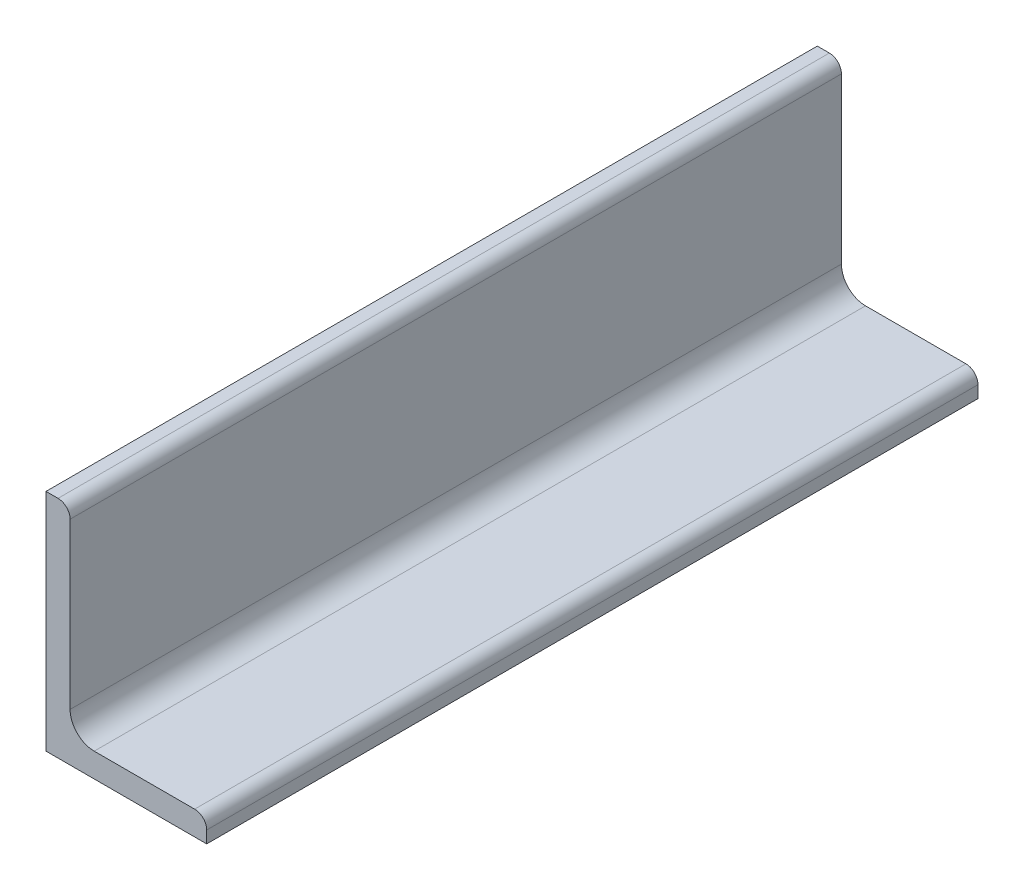
ISO-10303-21;
HEADER;
FILE_DESCRIPTION(('STEP AP214'),'2;1');
FILE_NAME('part.step','',(''),(''),'','','');
FILE_SCHEMA(('AUTOMOTIVE_DESIGN { 1 0 10303 214 1 1 1 1 }'));
ENDSEC;
DATA;
#1=APPLICATION_CONTEXT('core data for automotive mechanical design processes');
#2=APPLICATION_PROTOCOL_DEFINITION('international standard','automotive_design',2000,#1);
#3=PRODUCT_CONTEXT('',#1,'mechanical');
#4=PRODUCT('Part','Part','',(#3));
#5=PRODUCT_RELATED_PRODUCT_CATEGORY('part','',(#4));
#6=PRODUCT_DEFINITION_FORMATION('','',#4);
#7=PRODUCT_DEFINITION_CONTEXT('part definition',#1,'design');
#8=PRODUCT_DEFINITION('design','',#6,#7);
#9=PRODUCT_DEFINITION_SHAPE('','',#8);
#10=(LENGTH_UNIT() NAMED_UNIT(*) SI_UNIT(.MILLI.,.METRE.));
#11=(NAMED_UNIT(*) PLANE_ANGLE_UNIT() SI_UNIT($,.RADIAN.));
#12=(NAMED_UNIT(*) SI_UNIT($,.STERADIAN.) SOLID_ANGLE_UNIT());
#13=UNCERTAINTY_MEASURE_WITH_UNIT(LENGTH_MEASURE(1.E-05),#10,'distance_accuracy_value','');
#14=(GEOMETRIC_REPRESENTATION_CONTEXT(3) GLOBAL_UNCERTAINTY_ASSIGNED_CONTEXT((#13)) GLOBAL_UNIT_ASSIGNED_CONTEXT((#10,
#11,#12)) REPRESENTATION_CONTEXT('',''));
#15=CARTESIAN_POINT('',(0.,0.,0.));
#16=DIRECTION('',(0.,0.,1.));
#17=DIRECTION('',(1.,0.,0.));
#18=AXIS2_PLACEMENT_3D('',#15,#16,#17);
#19=CARTESIAN_POINT('',(0.897927251325018,89.7372005393545,304.8));
#20=DIRECTION('',(1.,0.,0.));
#21=DIRECTION('',(0.,0.,-1.));
#22=AXIS2_PLACEMENT_3D('',#19,#20,#21);
#23=PLANE('',#22);
#24=DIRECTION('',(0.,-1.,0.));
#25=VECTOR('',#24,1.);
#26=CARTESIAN_POINT('',(0.897927251325018,89.7372005393545,0.));
#27=LINE('',#26,#25);
#28=CARTESIAN_POINT('',(0.897927251325018,89.7372005393545,0.));
#29=VERTEX_POINT('',#28);
#30=CARTESIAN_POINT('',(0.897927251325018,0.837200539354535,0.));
#31=VERTEX_POINT('',#30);
#32=EDGE_CURVE('E135',#29,#31,#27,.T.);
#33=ORIENTED_EDGE('',*,*,#32,.T.);
#34=DIRECTION('',(0.,0.,-1.));
#35=VECTOR('',#34,1.);
#36=CARTESIAN_POINT('',(0.897927251325018,0.837200539354535,304.8));
#37=LINE('',#36,#35);
#38=CARTESIAN_POINT('',(0.897927251325018,0.837200539354535,304.8));
#39=VERTEX_POINT('',#38);
#40=EDGE_CURVE('E11',#39,#31,#37,.T.);
#41=ORIENTED_EDGE('',*,*,#40,.F.);
#42=DIRECTION('',(0.,-1.,0.));
#43=VECTOR('',#42,1.);
#44=CARTESIAN_POINT('',(0.897927251325018,89.7372005393545,304.8));
#45=LINE('',#44,#43);
#46=CARTESIAN_POINT('',(0.897927251325018,89.7372005393545,304.8));
#47=VERTEX_POINT('',#46);
#48=EDGE_CURVE('E151',#47,#39,#45,.T.);
#49=ORIENTED_EDGE('',*,*,#48,.F.);
#50=DIRECTION('',(0.,0.,-1.));
#51=VECTOR('',#50,1.);
#52=CARTESIAN_POINT('',(0.897927251325018,89.7372005393545,304.8));
#53=LINE('',#52,#51);
#54=EDGE_CURVE('E131',#47,#29,#53,.T.);
#55=ORIENTED_EDGE('',*,*,#54,.T.);
#56=EDGE_LOOP('',(#33,#41,#49,#55));
#57=FACE_BOUND('',#56,.T.);
#58=ADVANCED_FACE('F33',(#57),#23,.F.);
#59=CARTESIAN_POINT('',(0.897927251325018,0.837200539354535,304.8));
#60=DIRECTION('',(0.,1.,0.));
#61=DIRECTION('',(0.,0.,1.));
#62=AXIS2_PLACEMENT_3D('',#59,#60,#61);
#63=PLANE('',#62);
#64=DIRECTION('',(1.,0.,0.));
#65=VECTOR('',#64,1.);
#66=CARTESIAN_POINT('',(0.897927251325018,0.837200539354535,0.));
#67=LINE('',#66,#65);
#68=CARTESIAN_POINT('',(64.397927251325,0.837200539354535,0.));
#69=VERTEX_POINT('',#68);
#70=EDGE_CURVE('E138',#31,#69,#67,.T.);
#71=ORIENTED_EDGE('',*,*,#70,.T.);
#72=DIRECTION('',(0.,0.,-1.));
#73=VECTOR('',#72,1.);
#74=CARTESIAN_POINT('',(64.397927251325,0.837200539354535,304.8));
#75=LINE('',#74,#73);
#76=CARTESIAN_POINT('',(64.397927251325,0.837200539354535,304.8));
#77=VERTEX_POINT('',#76);
#78=EDGE_CURVE('E41',#77,#69,#75,.T.);
#79=ORIENTED_EDGE('',*,*,#78,.F.);
#80=DIRECTION('',(1.,0.,0.));
#81=VECTOR('',#80,1.);
#82=CARTESIAN_POINT('',(0.897927251325018,0.837200539354535,304.8));
#83=LINE('',#82,#81);
#84=EDGE_CURVE('E95',#39,#77,#83,.T.);
#85=ORIENTED_EDGE('',*,*,#84,.F.);
#86=ORIENTED_EDGE('',*,*,#40,.T.);
#87=EDGE_LOOP('',(#71,#79,#85,#86));
#88=FACE_BOUND('',#87,.T.);
#89=ADVANCED_FACE('F194',(#88),#63,.F.);
#90=CARTESIAN_POINT('',(64.397927251325,0.837200539354535,304.8));
#91=DIRECTION('',(-1.,0.,0.));
#92=DIRECTION('',(0.,0.,1.));
#93=AXIS2_PLACEMENT_3D('',#90,#91,#92);
#94=PLANE('',#93);
#95=DIRECTION('',(0.,1.,0.));
#96=VECTOR('',#95,1.);
#97=CARTESIAN_POINT('',(64.397927251325,0.837200539354535,0.));
#98=LINE('',#97,#96);
#99=CARTESIAN_POINT('',(64.397927251325,5.59970053935453,0.));
#100=VERTEX_POINT('',#99);
#101=EDGE_CURVE('E140',#69,#100,#98,.T.);
#102=ORIENTED_EDGE('',*,*,#101,.T.);
#103=DIRECTION('',(0.,0.,-1.));
#104=VECTOR('',#103,1.);
#105=CARTESIAN_POINT('',(64.397927251325,5.59970053935453,304.8));
#106=LINE('',#105,#104);
#107=CARTESIAN_POINT('',(64.397927251325,5.59970053935453,304.8));
#108=VERTEX_POINT('',#107);
#109=EDGE_CURVE('E161',#108,#100,#106,.T.);
#110=ORIENTED_EDGE('',*,*,#109,.F.);
#111=DIRECTION('',(0.,1.,0.));
#112=VECTOR('',#111,1.);
#113=CARTESIAN_POINT('',(64.397927251325,0.837200539354535,304.8));
#114=LINE('',#113,#112);
#115=EDGE_CURVE('E169',#77,#108,#114,.T.);
#116=ORIENTED_EDGE('',*,*,#115,.F.);
#117=ORIENTED_EDGE('',*,*,#78,.T.);
#118=EDGE_LOOP('',(#102,#110,#116,#117));
#119=FACE_BOUND('',#118,.T.);
#120=ADVANCED_FACE('F167',(#119),#94,.F.);
#121=CARTESIAN_POINT('',(59.635427251325,5.59970053935453,304.8));
#122=DIRECTION('',(0.,0.,-1.));
#123=DIRECTION('',(-1.,0.,0.));
#124=AXIS2_PLACEMENT_3D('',#121,#122,#123);
#125=CYLINDRICAL_SURFACE('',#124,4.7625);
#126=CARTESIAN_POINT('',(59.635427251325,5.59970053935453,0.));
#127=DIRECTION('',(0.,0.,1.));
#128=DIRECTION('',(1.,0.,0.));
#129=AXIS2_PLACEMENT_3D('',#126,#127,#128);
#130=CIRCLE('',#129,4.7625);
#131=CARTESIAN_POINT('',(59.635427251325,10.3622005393545,0.));
#132=VERTEX_POINT('',#131);
#133=EDGE_CURVE('E142',#100,#132,#130,.T.);
#134=ORIENTED_EDGE('',*,*,#133,.T.);
#135=DIRECTION('',(0.,0.,-1.));
#136=VECTOR('',#135,1.);
#137=CARTESIAN_POINT('',(59.635427251325,10.3622005393545,304.8));
#138=LINE('',#137,#136);
#139=CARTESIAN_POINT('',(59.635427251325,10.3622005393545,304.8));
#140=VERTEX_POINT('',#139);
#141=EDGE_CURVE('E158',#140,#132,#138,.T.);
#142=ORIENTED_EDGE('',*,*,#141,.F.);
#143=CARTESIAN_POINT('',(59.635427251325,5.59970053935453,304.8));
#144=DIRECTION('',(0.,0.,1.));
#145=DIRECTION('',(1.,0.,0.));
#146=AXIS2_PLACEMENT_3D('',#143,#144,#145);
#147=CIRCLE('',#146,4.7625);
#148=EDGE_CURVE('E185',#108,#140,#147,.T.);
#149=ORIENTED_EDGE('',*,*,#148,.F.);
#150=ORIENTED_EDGE('',*,*,#109,.T.);
#151=EDGE_LOOP('',(#134,#142,#149,#150));
#152=FACE_BOUND('',#151,.T.);
#153=ADVANCED_FACE('F178',(#152),#125,.T.);
#154=CARTESIAN_POINT('',(59.635427251325,10.3622005393545,304.8));
#155=DIRECTION('',(0.,-1.,0.));
#156=DIRECTION('',(0.,0.,-1.));
#157=AXIS2_PLACEMENT_3D('',#154,#155,#156);
#158=PLANE('',#157);
#159=DIRECTION('',(-1.,0.,0.));
#160=VECTOR('',#159,1.);
#161=CARTESIAN_POINT('',(59.635427251325,10.3622005393545,0.));
#162=LINE('',#161,#160);
#163=CARTESIAN_POINT('',(19.947927251325,10.3622005393545,0.));
#164=VERTEX_POINT('',#163);
#165=EDGE_CURVE('E144',#132,#164,#162,.T.);
#166=ORIENTED_EDGE('',*,*,#165,.T.);
#167=DIRECTION('',(0.,0.,-1.));
#168=VECTOR('',#167,1.);
#169=CARTESIAN_POINT('',(19.947927251325,10.3622005393545,304.8));
#170=LINE('',#169,#168);
#171=CARTESIAN_POINT('',(19.947927251325,10.3622005393545,304.8));
#172=VERTEX_POINT('',#171);
#173=EDGE_CURVE('E155',#172,#164,#170,.T.);
#174=ORIENTED_EDGE('',*,*,#173,.F.);
#175=DIRECTION('',(-1.,0.,0.));
#176=VECTOR('',#175,1.);
#177=CARTESIAN_POINT('',(59.635427251325,10.3622005393545,304.8));
#178=LINE('',#177,#176);
#179=EDGE_CURVE('E184',#140,#172,#178,.T.);
#180=ORIENTED_EDGE('',*,*,#179,.F.);
#181=ORIENTED_EDGE('',*,*,#141,.T.);
#182=EDGE_LOOP('',(#166,#174,#180,#181));
#183=FACE_BOUND('',#182,.T.);
#184=ADVANCED_FACE('F182',(#183),#158,.F.);
#185=CARTESIAN_POINT('',(19.947927251325,19.8872005393545,304.8));
#186=DIRECTION('',(0.,0.,-1.));
#187=DIRECTION('',(-1.,0.,0.));
#188=AXIS2_PLACEMENT_3D('',#185,#186,#187);
#189=CYLINDRICAL_SURFACE('',#188,9.52499999999999);
#190=CARTESIAN_POINT('',(19.947927251325,19.8872005393545,0.));
#191=DIRECTION('',(0.,0.,-1.));
#192=DIRECTION('',(1.,0.,0.));
#193=AXIS2_PLACEMENT_3D('',#190,#191,#192);
#194=CIRCLE('',#193,9.52499999999999);
#195=CARTESIAN_POINT('',(10.422927251325,19.8872005393545,0.));
#196=VERTEX_POINT('',#195);
#197=EDGE_CURVE('E146',#164,#196,#194,.T.);
#198=ORIENTED_EDGE('',*,*,#197,.T.);
#199=DIRECTION('',(0.,0.,-1.));
#200=VECTOR('',#199,1.);
#201=CARTESIAN_POINT('',(10.422927251325,19.8872005393545,304.8));
#202=LINE('',#201,#200);
#203=CARTESIAN_POINT('',(10.422927251325,19.8872005393545,304.8));
#204=VERTEX_POINT('',#203);
#205=EDGE_CURVE('E126',#204,#196,#202,.T.);
#206=ORIENTED_EDGE('',*,*,#205,.F.);
#207=CARTESIAN_POINT('',(19.947927251325,19.8872005393545,304.8));
#208=DIRECTION('',(0.,0.,-1.));
#209=DIRECTION('',(1.,0.,0.));
#210=AXIS2_PLACEMENT_3D('',#207,#208,#209);
#211=CIRCLE('',#210,9.52499999999999);
#212=EDGE_CURVE('E117',#172,#204,#211,.T.);
#213=ORIENTED_EDGE('',*,*,#212,.F.);
#214=ORIENTED_EDGE('',*,*,#173,.T.);
#215=EDGE_LOOP('',(#198,#206,#213,#214));
#216=FACE_BOUND('',#215,.T.);
#217=ADVANCED_FACE('F206',(#216),#189,.F.);
#218=CARTESIAN_POINT('',(10.422927251325,19.8872005393545,304.8));
#219=DIRECTION('',(-1.,0.,0.));
#220=DIRECTION('',(0.,0.,1.));
#221=AXIS2_PLACEMENT_3D('',#218,#219,#220);
#222=PLANE('',#221);
#223=DIRECTION('',(0.,1.,0.));
#224=VECTOR('',#223,1.);
#225=CARTESIAN_POINT('',(10.422927251325,19.8872005393545,0.));
#226=LINE('',#225,#224);
#227=CARTESIAN_POINT('',(10.422927251325,84.9747005393545,0.));
#228=VERTEX_POINT('',#227);
#229=EDGE_CURVE('E125',#196,#228,#226,.T.);
#230=ORIENTED_EDGE('',*,*,#229,.T.);
#231=DIRECTION('',(0.,0.,-1.));
#232=VECTOR('',#231,1.);
#233=CARTESIAN_POINT('',(10.422927251325,84.9747005393545,304.8));
#234=LINE('',#233,#232);
#235=CARTESIAN_POINT('',(10.422927251325,84.9747005393545,304.8));
#236=VERTEX_POINT('',#235);
#237=EDGE_CURVE('E122',#236,#228,#234,.T.);
#238=ORIENTED_EDGE('',*,*,#237,.F.);
#239=DIRECTION('',(0.,1.,0.));
#240=VECTOR('',#239,1.);
#241=CARTESIAN_POINT('',(10.422927251325,19.8872005393545,304.8));
#242=LINE('',#241,#240);
#243=EDGE_CURVE('E111',#204,#236,#242,.T.);
#244=ORIENTED_EDGE('',*,*,#243,.F.);
#245=ORIENTED_EDGE('',*,*,#205,.T.);
#246=EDGE_LOOP('',(#230,#238,#244,#245));
#247=FACE_BOUND('',#246,.T.);
#248=ADVANCED_FACE('F123',(#247),#222,.F.);
#249=CARTESIAN_POINT('',(5.66042725132501,84.9747005393545,304.8));
#250=DIRECTION('',(0.,0.,-1.));
#251=DIRECTION('',(-1.,0.,0.));
#252=AXIS2_PLACEMENT_3D('',#249,#250,#251);
#253=CYLINDRICAL_SURFACE('',#252,4.7625);
#254=CARTESIAN_POINT('',(5.66042725132501,84.9747005393545,0.));
#255=DIRECTION('',(0.,0.,1.));
#256=DIRECTION('',(1.,0.,0.));
#257=AXIS2_PLACEMENT_3D('',#254,#255,#256);
#258=CIRCLE('',#257,4.7625);
#259=CARTESIAN_POINT('',(5.66042725132502,89.7372005393545,0.));
#260=VERTEX_POINT('',#259);
#261=EDGE_CURVE('E81',#228,#260,#258,.T.);
#262=ORIENTED_EDGE('',*,*,#261,.T.);
#263=DIRECTION('',(0.,0.,-1.));
#264=VECTOR('',#263,1.);
#265=CARTESIAN_POINT('',(5.66042725132502,89.7372005393545,304.8));
#266=LINE('',#265,#264);
#267=CARTESIAN_POINT('',(5.66042725132502,89.7372005393545,304.8));
#268=VERTEX_POINT('',#267);
#269=EDGE_CURVE('E127',#268,#260,#266,.T.);
#270=ORIENTED_EDGE('',*,*,#269,.F.);
#271=CARTESIAN_POINT('',(5.66042725132501,84.9747005393545,304.8));
#272=DIRECTION('',(0.,0.,1.));
#273=DIRECTION('',(1.,0.,0.));
#274=AXIS2_PLACEMENT_3D('',#271,#272,#273);
#275=CIRCLE('',#274,4.7625);
#276=EDGE_CURVE('E115',#236,#268,#275,.T.);
#277=ORIENTED_EDGE('',*,*,#276,.F.);
#278=ORIENTED_EDGE('',*,*,#237,.T.);
#279=EDGE_LOOP('',(#262,#270,#277,#278));
#280=FACE_BOUND('',#279,.T.);
#281=ADVANCED_FACE('F129',(#280),#253,.T.);
#282=CARTESIAN_POINT('',(5.66042725132502,89.7372005393545,304.8));
#283=DIRECTION('',(0.,-1.,0.));
#284=DIRECTION('',(0.,0.,-1.));
#285=AXIS2_PLACEMENT_3D('',#282,#283,#284);
#286=PLANE('',#285);
#287=DIRECTION('',(-1.,0.,0.));
#288=VECTOR('',#287,1.);
#289=CARTESIAN_POINT('',(5.66042725132502,89.7372005393545,0.));
#290=LINE('',#289,#288);
#291=EDGE_CURVE('E87',#260,#29,#290,.T.);
#292=ORIENTED_EDGE('',*,*,#291,.T.);
#293=ORIENTED_EDGE('',*,*,#54,.F.);
#294=DIRECTION('',(-1.,0.,0.));
#295=VECTOR('',#294,1.);
#296=CARTESIAN_POINT('',(5.66042725132502,89.7372005393545,304.8));
#297=LINE('',#296,#295);
#298=EDGE_CURVE('E49',#268,#47,#297,.T.);
#299=ORIENTED_EDGE('',*,*,#298,.F.);
#300=ORIENTED_EDGE('',*,*,#269,.T.);
#301=EDGE_LOOP('',(#292,#293,#299,#300));
#302=FACE_BOUND('',#301,.T.);
#303=ADVANCED_FACE('F214',(#302),#286,.F.);
#304=CARTESIAN_POINT('',(59.635427251325,5.59970053935453,304.8));
#305=DIRECTION('',(0.,0.,1.));
#306=DIRECTION('',(1.,0.,0.));
#307=AXIS2_PLACEMENT_3D('',#304,#305,#306);
#308=PLANE('',#307);
#309=ORIENTED_EDGE('',*,*,#48,.T.);
#310=ORIENTED_EDGE('',*,*,#84,.T.);
#311=ORIENTED_EDGE('',*,*,#115,.T.);
#312=ORIENTED_EDGE('',*,*,#148,.T.);
#313=ORIENTED_EDGE('',*,*,#179,.T.);
#314=ORIENTED_EDGE('',*,*,#212,.T.);
#315=ORIENTED_EDGE('',*,*,#243,.T.);
#316=ORIENTED_EDGE('',*,*,#276,.T.);
#317=ORIENTED_EDGE('',*,*,#298,.T.);
#318=EDGE_LOOP('',(#309,#310,#311,#312,#313,#314,#315,#316,#317));
#319=FACE_BOUND('',#318,.T.);
#320=ADVANCED_FACE('F113',(#319),#308,.T.);
#321=CARTESIAN_POINT('',(59.635427251325,5.59970053935453,0.));
#322=DIRECTION('',(0.,0.,1.));
#323=DIRECTION('',(1.,0.,0.));
#324=AXIS2_PLACEMENT_3D('',#321,#322,#323);
#325=PLANE('',#324);
#326=ORIENTED_EDGE('',*,*,#32,.F.);
#327=ORIENTED_EDGE('',*,*,#291,.F.);
#328=ORIENTED_EDGE('',*,*,#261,.F.);
#329=ORIENTED_EDGE('',*,*,#229,.F.);
#330=ORIENTED_EDGE('',*,*,#197,.F.);
#331=ORIENTED_EDGE('',*,*,#165,.F.);
#332=ORIENTED_EDGE('',*,*,#133,.F.);
#333=ORIENTED_EDGE('',*,*,#101,.F.);
#334=ORIENTED_EDGE('',*,*,#70,.F.);
#335=EDGE_LOOP('',(#326,#327,#328,#329,#330,#331,#332,#333,#334));
#336=FACE_BOUND('',#335,.T.);
#337=ADVANCED_FACE('F173',(#336),#325,.F.);
#338=CLOSED_SHELL('',(#58,#89,#120,#153,#184,#217,#248,#281,#303,#320,#337));
#339=MANIFOLD_SOLID_BREP('B2',#338);
#340=ADVANCED_BREP_SHAPE_REPRESENTATION('',(#18,#339),#14);
#341=SHAPE_DEFINITION_REPRESENTATION(#9,#340);
ENDSEC;
END-ISO-10303-21;
